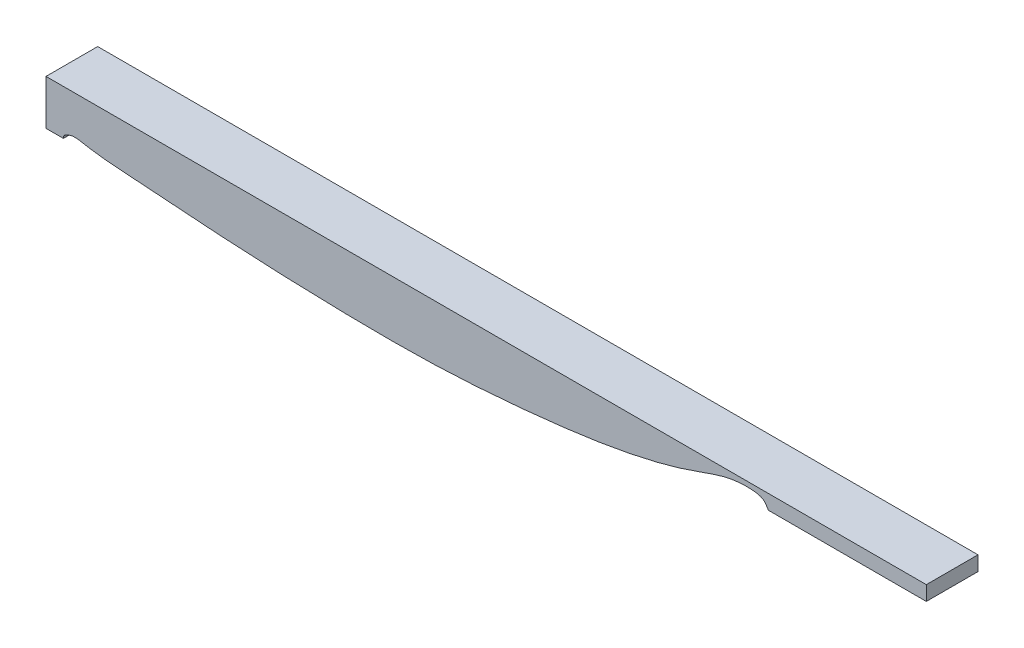
ISO-10303-21;
HEADER;
FILE_DESCRIPTION(('STEP AP214'),'2;1');
FILE_NAME('part.step','',(''),(''),'','','');
FILE_SCHEMA(('AUTOMOTIVE_DESIGN { 1 0 10303 214 1 1 1 1 }'));
ENDSEC;
DATA;
#1=APPLICATION_CONTEXT('core data for automotive mechanical design processes');
#2=APPLICATION_PROTOCOL_DEFINITION('international standard','automotive_design',2000,#1);
#3=PRODUCT_CONTEXT('',#1,'mechanical');
#4=PRODUCT('Part','Part','',(#3));
#5=PRODUCT_RELATED_PRODUCT_CATEGORY('part','',(#4));
#6=PRODUCT_DEFINITION_FORMATION('','',#4);
#7=PRODUCT_DEFINITION_CONTEXT('part definition',#1,'design');
#8=PRODUCT_DEFINITION('design','',#6,#7);
#9=PRODUCT_DEFINITION_SHAPE('','',#8);
#10=(LENGTH_UNIT() NAMED_UNIT(*) SI_UNIT(.MILLI.,.METRE.));
#11=(NAMED_UNIT(*) PLANE_ANGLE_UNIT() SI_UNIT($,.RADIAN.));
#12=(NAMED_UNIT(*) SI_UNIT($,.STERADIAN.) SOLID_ANGLE_UNIT());
#13=UNCERTAINTY_MEASURE_WITH_UNIT(LENGTH_MEASURE(1.E-05),#10,'distance_accuracy_value','');
#14=(GEOMETRIC_REPRESENTATION_CONTEXT(3) GLOBAL_UNCERTAINTY_ASSIGNED_CONTEXT((#13)) GLOBAL_UNIT_ASSIGNED_CONTEXT((#10,
#11,#12)) REPRESENTATION_CONTEXT('',''));
#15=CARTESIAN_POINT('',(0.,0.,0.));
#16=DIRECTION('',(0.,0.,1.));
#17=DIRECTION('',(1.,0.,0.));
#18=AXIS2_PLACEMENT_3D('',#15,#16,#17);
#19=CARTESIAN_POINT('',(-74.7926333005804,-4.71539229027496,500.));
#20=CARTESIAN_POINT('',(-74.7945725468308,-4.64169918988929,500.));
#21=CARTESIAN_POINT('',(-74.7956405223139,-4.5669255233357,500.));
#22=CARTESIAN_POINT('',(-74.7682275652313,-4.4215014351939,500.));
#23=CARTESIAN_POINT('',(-74.7393396719435,-4.35122443452808,500.));
#24=CARTESIAN_POINT('',(-74.6541649574875,-4.23140071534592,500.));
#25=CARTESIAN_POINT('',(-74.5952717248445,-4.18346464085846,500.));
#26=CARTESIAN_POINT('',(-74.472232026393,-4.10658868034385,500.));
#27=CARTESIAN_POINT('',(-74.4083565466093,-4.07230546591333,500.));
#28=CARTESIAN_POINT('',(-74.0910930728462,-3.8971609381395,500.));
#29=CARTESIAN_POINT('',(-73.8228264342802,-3.77733079104681,500.));
#30=CARTESIAN_POINT('',(-73.3969897090454,-3.69655194401499,500.));
#31=CARTESIAN_POINT('',(-73.2507537679305,-3.68371619555192,500.));
#32=CARTESIAN_POINT('',(-72.9622916337156,-3.67746946263042,500.));
#33=CARTESIAN_POINT('',(-72.8186453982501,-3.6836659885184,500.));
#34=CARTESIAN_POINT('',(-72.38872759527,-3.71852470973582,500.));
#35=CARTESIAN_POINT('',(-72.1031532164035,-3.76168161506621,500.));
#36=CARTESIAN_POINT('',(-71.5338997361211,-3.86135873448905,500.));
#37=CARTESIAN_POINT('',(-71.2503899064792,-3.91857891513571,500.));
#38=CARTESIAN_POINT('',(-70.6814803741391,-4.02052917402074,500.));
#39=CARTESIAN_POINT('',(-70.3963885082395,-4.06729373448404,500.));
#40=CARTESIAN_POINT('',(-69.5389001396878,-4.19296329365171,500.));
#41=CARTESIAN_POINT('',(-68.9639748335471,-4.25649582072183,500.));
#42=CARTESIAN_POINT('',(-67.8122730176995,-4.36494349914614,500.));
#43=CARTESIAN_POINT('',(-67.2356798980453,-4.40951686606346,500.));
#44=CARTESIAN_POINT('',(-66.0824703463037,-4.49836048424999,500.));
#45=CARTESIAN_POINT('',(-65.5059095068004,-4.54335356792675,500.));
#46=CARTESIAN_POINT('',(-63.7759582658489,-4.67483880455262,500.));
#47=CARTESIAN_POINT('',(-62.6223117172394,-4.75800045087998,500.));
#48=CARTESIAN_POINT('',(-59.1613455171114,-5.00714012243561,500.));
#49=CARTESIAN_POINT('',(-56.8537968480041,-5.1701246724821,500.));
#50=CARTESIAN_POINT('',(-52.2377474418746,-5.48208649526239,500.));
#51=CARTESIAN_POINT('',(-49.9290338140273,-5.62838689929557,500.));
#52=CARTESIAN_POINT('',(-45.3097349084676,-5.88528373667809,500.));
#53=CARTESIAN_POINT('',(-42.9989883793476,-5.99606203608369,500.));
#54=CARTESIAN_POINT('',(-38.3762612017863,-6.17825690245451,500.));
#55=CARTESIAN_POINT('',(-36.0644189723049,-6.25055351148465,500.));
#56=CARTESIAN_POINT('',(-31.4399540416971,-6.36449010102732,500.));
#57=CARTESIAN_POINT('',(-29.1273420464109,-6.40655060285978,500.));
#58=CARTESIAN_POINT('',(-24.5009026983581,-6.44293282827627,500.));
#59=CARTESIAN_POINT('',(-22.1876388977882,-6.43588554790579,500.));
#60=CARTESIAN_POINT('',(-17.5622645478349,-6.34057695604946,500.));
#61=CARTESIAN_POINT('',(-15.2504436589645,-6.25148343036184,500.));
#62=CARTESIAN_POINT('',(-10.6338606527194,-5.99181558491172,500.));
#63=CARTESIAN_POINT('',(-8.32821716846093,-5.82325504427962,500.));
#64=CARTESIAN_POINT('',(-3.72092935671084,-5.42764728901088,500.));
#65=CARTESIAN_POINT('',(-1.41871000812324,-5.20011518013204,500.));
#66=CARTESIAN_POINT('',(3.17658171697913,-4.672543946867,500.));
#67=CARTESIAN_POINT('',(5.47096725490909,-4.37454900242464,500.));
#68=CARTESIAN_POINT('',(8.8991543822941,-3.8451804505402,500.));
#69=CARTESIAN_POINT('',(10.0393568862103,-3.65439157818723,500.));
#70=CARTESIAN_POINT('',(12.313175735897,-3.23545150921731,500.));
#71=CARTESIAN_POINT('',(13.4470128405496,-3.00668345580054,500.));
#72=CARTESIAN_POINT('',(15.7065243350755,-2.51115196509788,500.));
#73=CARTESIAN_POINT('',(16.8314927717673,-2.24543901580171,500.));
#74=CARTESIAN_POINT('',(19.0681514075692,-1.66423417883567,500.));
#75=CARTESIAN_POINT('',(20.1797168960365,-1.34827476199462,500.));
#76=CARTESIAN_POINT('',(21.8322121034182,-0.818652958403885,500.));
#77=CARTESIAN_POINT('',(22.3806133737634,-0.632964751650442,500.));
#78=CARTESIAN_POINT('',(23.4745977305323,-0.251714185271417,500.));
#79=CARTESIAN_POINT('',(24.0198153161863,-0.0547273099881246,500.));
#80=CARTESIAN_POINT('',(25.6575931319565,0.52861536663819,500.));
#81=CARTESIAN_POINT('',(26.7531107345004,0.904369525850969,500.));
#82=CARTESIAN_POINT('',(28.4483206177596,1.28182868892305,500.));
#83=CARTESIAN_POINT('',(29.0224629114196,1.37512574816498,500.));
#84=CARTESIAN_POINT('',(30.1897519726394,1.49359228512873,500.));
#85=CARTESIAN_POINT('',(30.7798455836017,1.51990450574938,500.));
#86=CARTESIAN_POINT('',(31.6578059291401,1.49536836942824,500.));
#87=CARTESIAN_POINT('',(31.9500625145701,1.47700096365145,500.));
#88=CARTESIAN_POINT('',(32.3871741682909,1.41676227533782,500.));
#89=CARTESIAN_POINT('',(32.5328176215044,1.39133693180517,500.));
#90=CARTESIAN_POINT('',(32.8229989541255,1.32775463723204,500.));
#91=CARTESIAN_POINT('',(32.9658317262134,1.28942763038719,500.));
#92=CARTESIAN_POINT('',(33.2434271180678,1.18941318569901,500.));
#93=CARTESIAN_POINT('',(33.3802106279673,1.12603395811575,500.));
#94=CARTESIAN_POINT('',(33.6269293118561,0.962446148861271,500.));
#95=CARTESIAN_POINT('',(33.7339165324965,0.860387328718621,500.));
#96=CARTESIAN_POINT('',(33.9276639242706,0.633447513574679,500.));
#97=CARTESIAN_POINT('',(34.0117892478651,0.51070487600079,500.));
#98=CARTESIAN_POINT('',(34.1435301858947,0.330629947473623,500.));
#99=CARTESIAN_POINT('',(34.1877309860986,0.270813837437645,500.));
#100=CARTESIAN_POINT('',(34.2652055782027,0.143233685237576,500.));
#101=CARTESIAN_POINT('',(34.2961884644061,0.0749305651906201,500.));
#102=CARTESIAN_POINT('',(34.3054676045378,0.,500.));
#103=B_SPLINE_CURVE_WITH_KNOTS('',3,(#19,#20,#21,#22,#23,#24,#25,#26,#27,#28,#29,#30,#31,#32,
#33,#34,#35,#36,#37,#38,#39,#40,#41,#42,#43,#44,#45,#46,#47,#48,#49,#50,#51,#52,#53,#54,#55,#56,
#57,#58,#59,#60,#61,#62,#63,#64,#65,#66,#67,#68,#69,#70,#71,#72,#73,#74,#75,#76,#77,#78,#79,#80,
#81,#82,#83,#84,#85,#86,#87,#88,#89,#90,#91,#92,#93,#94,#95,#96,#97,#98,#99,#100,#101,#102),
.UNSPECIFIED.,.F.,.F.,(4,2,2,2,2,2,2,2,2,2,2,2,2,2,2,2,2,2,2,2,2,2,2,2,2,2,2,2,2,2,2,2,2,2,2,2,
2,2,2,2,2,4),(0.,0.001953125,0.00390625000000011,0.00585937500000022,0.00781250000000033,
0.015625,0.0195312499999999,0.0234374999999999,0.0312499999999999,0.0390624999999999,
0.0468749999999999,0.0624999999999999,0.078125,0.09375,0.125,0.1875,0.25,0.3125,0.375,0.4375,
0.5,0.5625,0.625,0.6875,0.75,0.78125,0.8125,0.84375,0.875,0.890625,0.90625,0.9375,0.953125,
0.96875,0.9765625,0.98046875,0.984375,0.98828125,0.9921875,0.99609375,0.998046875,1.),.UNSPECIFIED.);
#104=DIRECTION('',(0.,0.,-1.));
#105=VECTOR('',#104,1.);
#106=SURFACE_OF_LINEAR_EXTRUSION('',#103,#105);
#107=CARTESIAN_POINT('',(-74.7926333005804,-4.71539229027496,492.));
#108=CARTESIAN_POINT('',(-74.7945725468308,-4.64169918988929,492.));
#109=CARTESIAN_POINT('',(-74.7956405223139,-4.5669255233357,492.));
#110=CARTESIAN_POINT('',(-74.7682275652313,-4.4215014351939,492.));
#111=CARTESIAN_POINT('',(-74.7393396719435,-4.35122443452808,492.));
#112=CARTESIAN_POINT('',(-74.6541649574875,-4.23140071534592,492.));
#113=CARTESIAN_POINT('',(-74.5952717248445,-4.18346464085846,492.));
#114=CARTESIAN_POINT('',(-74.472232026393,-4.10658868034385,492.));
#115=CARTESIAN_POINT('',(-74.4083565466093,-4.07230546591333,492.));
#116=CARTESIAN_POINT('',(-74.0910930728462,-3.8971609381395,492.));
#117=CARTESIAN_POINT('',(-73.8228264342802,-3.77733079104681,492.));
#118=CARTESIAN_POINT('',(-73.3969897090454,-3.69655194401499,492.));
#119=CARTESIAN_POINT('',(-73.2507537679305,-3.68371619555192,492.));
#120=CARTESIAN_POINT('',(-72.9622916337156,-3.67746946263042,492.));
#121=CARTESIAN_POINT('',(-72.8186453982501,-3.6836659885184,492.));
#122=CARTESIAN_POINT('',(-72.38872759527,-3.71852470973582,492.));
#123=CARTESIAN_POINT('',(-72.1031532164035,-3.76168161506621,492.));
#124=CARTESIAN_POINT('',(-71.5338997361211,-3.86135873448905,492.));
#125=CARTESIAN_POINT('',(-71.2503899064792,-3.91857891513571,492.));
#126=CARTESIAN_POINT('',(-70.6814803741391,-4.02052917402074,492.));
#127=CARTESIAN_POINT('',(-70.3963885082395,-4.06729373448404,492.));
#128=CARTESIAN_POINT('',(-69.5389001396878,-4.19296329365171,492.));
#129=CARTESIAN_POINT('',(-68.9639748335471,-4.25649582072183,492.));
#130=CARTESIAN_POINT('',(-67.8122730176995,-4.36494349914614,492.));
#131=CARTESIAN_POINT('',(-67.2356798980453,-4.40951686606346,492.));
#132=CARTESIAN_POINT('',(-66.0824703463037,-4.49836048424999,492.));
#133=CARTESIAN_POINT('',(-65.5059095068004,-4.54335356792675,492.));
#134=CARTESIAN_POINT('',(-63.7759582658489,-4.67483880455262,492.));
#135=CARTESIAN_POINT('',(-62.6223117172394,-4.75800045087998,492.));
#136=CARTESIAN_POINT('',(-59.1613455171114,-5.00714012243561,492.));
#137=CARTESIAN_POINT('',(-56.8537968480041,-5.1701246724821,492.));
#138=CARTESIAN_POINT('',(-52.2377474418746,-5.48208649526239,492.));
#139=CARTESIAN_POINT('',(-49.9290338140273,-5.62838689929557,492.));
#140=CARTESIAN_POINT('',(-45.3097349084676,-5.88528373667809,492.));
#141=CARTESIAN_POINT('',(-42.9989883793476,-5.99606203608369,492.));
#142=CARTESIAN_POINT('',(-38.3762612017863,-6.17825690245451,492.));
#143=CARTESIAN_POINT('',(-36.0644189723049,-6.25055351148465,492.));
#144=CARTESIAN_POINT('',(-31.4399540416971,-6.36449010102732,492.));
#145=CARTESIAN_POINT('',(-29.1273420464109,-6.40655060285978,492.));
#146=CARTESIAN_POINT('',(-24.5009026983581,-6.44293282827627,492.));
#147=CARTESIAN_POINT('',(-22.1876388977882,-6.43588554790579,492.));
#148=CARTESIAN_POINT('',(-17.5622645478349,-6.34057695604946,492.));
#149=CARTESIAN_POINT('',(-15.2504436589645,-6.25148343036184,492.));
#150=CARTESIAN_POINT('',(-10.6338606527194,-5.99181558491172,492.));
#151=CARTESIAN_POINT('',(-8.32821716846093,-5.82325504427962,492.));
#152=CARTESIAN_POINT('',(-3.72092935671084,-5.42764728901088,492.));
#153=CARTESIAN_POINT('',(-1.41871000812324,-5.20011518013204,492.));
#154=CARTESIAN_POINT('',(3.17658171697913,-4.672543946867,492.));
#155=CARTESIAN_POINT('',(5.47096725490909,-4.37454900242464,492.));
#156=CARTESIAN_POINT('',(8.8991543822941,-3.8451804505402,492.));
#157=CARTESIAN_POINT('',(10.0393568862103,-3.65439157818723,492.));
#158=CARTESIAN_POINT('',(12.313175735897,-3.23545150921731,492.));
#159=CARTESIAN_POINT('',(13.4470128405496,-3.00668345580054,492.));
#160=CARTESIAN_POINT('',(15.7065243350755,-2.51115196509788,492.));
#161=CARTESIAN_POINT('',(16.8314927717673,-2.24543901580171,492.));
#162=CARTESIAN_POINT('',(19.0681514075692,-1.66423417883567,492.));
#163=CARTESIAN_POINT('',(20.1797168960365,-1.34827476199462,492.));
#164=CARTESIAN_POINT('',(21.8322121034182,-0.818652958403885,492.));
#165=CARTESIAN_POINT('',(22.3806133737634,-0.632964751650442,492.));
#166=CARTESIAN_POINT('',(23.4745977305323,-0.251714185271417,492.));
#167=CARTESIAN_POINT('',(24.0198153161863,-0.0547273099881246,492.));
#168=CARTESIAN_POINT('',(25.6575931319565,0.52861536663819,492.));
#169=CARTESIAN_POINT('',(26.7531107345004,0.904369525850969,492.));
#170=CARTESIAN_POINT('',(28.4483206177596,1.28182868892305,492.));
#171=CARTESIAN_POINT('',(29.0224629114196,1.37512574816498,492.));
#172=CARTESIAN_POINT('',(30.1897519726394,1.49359228512873,492.));
#173=CARTESIAN_POINT('',(30.7798455836017,1.51990450574938,492.));
#174=CARTESIAN_POINT('',(31.6578059291401,1.49536836942824,492.));
#175=CARTESIAN_POINT('',(31.9500625145701,1.47700096365145,492.));
#176=CARTESIAN_POINT('',(32.3871741682909,1.41676227533782,492.));
#177=CARTESIAN_POINT('',(32.5328176215044,1.39133693180517,492.));
#178=CARTESIAN_POINT('',(32.8229989541255,1.32775463723204,492.));
#179=CARTESIAN_POINT('',(32.9658317262134,1.28942763038719,492.));
#180=CARTESIAN_POINT('',(33.2434271180678,1.18941318569901,492.));
#181=CARTESIAN_POINT('',(33.3802106279673,1.12603395811575,492.));
#182=CARTESIAN_POINT('',(33.6269293118561,0.962446148861271,492.));
#183=CARTESIAN_POINT('',(33.7339165324965,0.860387328718621,492.));
#184=CARTESIAN_POINT('',(33.9276639242706,0.633447513574679,492.));
#185=CARTESIAN_POINT('',(34.0117892478651,0.51070487600079,492.));
#186=CARTESIAN_POINT('',(34.1435301858947,0.330629947473623,492.));
#187=CARTESIAN_POINT('',(34.1877309860986,0.270813837437645,492.));
#188=CARTESIAN_POINT('',(34.2652055782027,0.143233685237576,492.));
#189=CARTESIAN_POINT('',(34.2961884644061,0.0749305651906201,492.));
#190=CARTESIAN_POINT('',(34.3054676045378,0.,492.));
#191=B_SPLINE_CURVE_WITH_KNOTS('',3,(#107,#108,#109,#110,#111,#112,#113,#114,#115,#116,#117,
#118,#119,#120,#121,#122,#123,#124,#125,#126,#127,#128,#129,#130,#131,#132,#133,#134,#135,#136,
#137,#138,#139,#140,#141,#142,#143,#144,#145,#146,#147,#148,#149,#150,#151,#152,#153,#154,#155,
#156,#157,#158,#159,#160,#161,#162,#163,#164,#165,#166,#167,#168,#169,#170,#171,#172,#173,#174,
#175,#176,#177,#178,#179,#180,#181,#182,#183,#184,#185,#186,#187,#188,#189,#190),.UNSPECIFIED.,
.F.,.F.,(4,2,2,2,2,2,2,2,2,2,2,2,2,2,2,2,2,2,2,2,2,2,2,2,2,2,2,2,2,2,2,2,2,2,2,2,2,2,2,2,2,4),
(0.,0.001953125,0.00390625000000011,0.00585937500000022,0.00781250000000033,0.015625,
0.0195312499999999,0.0234374999999999,0.0312499999999999,0.0390624999999999,0.0468749999999999,
0.0624999999999999,0.078125,0.09375,0.125,0.1875,0.25,0.3125,0.375,0.4375,0.5,0.5625,0.625,
0.6875,0.75,0.78125,0.8125,0.84375,0.875,0.890625,0.90625,0.9375,0.953125,0.96875,0.9765625,
0.98046875,0.984375,0.98828125,0.9921875,0.99609375,0.998046875,1.),.UNSPECIFIED.);
#192=CARTESIAN_POINT('',(-74.7926333005804,-4.715392290275,492.));
#193=VERTEX_POINT('',#192);
#194=CARTESIAN_POINT('',(34.3054676045377,0.,492.));
#195=VERTEX_POINT('',#194);
#196=EDGE_CURVE('E165',#193,#195,#191,.T.);
#197=ORIENTED_EDGE('',*,*,#196,.T.);
#198=DIRECTION('',(0.,0.,-1.));
#199=VECTOR('',#198,1.);
#200=CARTESIAN_POINT('',(34.3054676045377,0.,500.));
#201=LINE('',#200,#199);
#202=CARTESIAN_POINT('',(34.3054676045377,0.,500.));
#203=VERTEX_POINT('',#202);
#204=EDGE_CURVE('E11',#203,#195,#201,.T.);
#205=ORIENTED_EDGE('',*,*,#204,.F.);
#206=CARTESIAN_POINT('',(34.3054676045378,0.,500.));
#207=CARTESIAN_POINT('',(34.2961884644061,0.0749305651906201,500.));
#208=CARTESIAN_POINT('',(34.2652055782027,0.143233685237576,500.));
#209=CARTESIAN_POINT('',(34.1877309860986,0.270813837437645,500.));
#210=CARTESIAN_POINT('',(34.1435301858947,0.330629947473623,500.));
#211=CARTESIAN_POINT('',(34.0117892478651,0.51070487600079,500.));
#212=CARTESIAN_POINT('',(33.9276639242706,0.633447513574679,500.));
#213=CARTESIAN_POINT('',(33.7339165324965,0.860387328718621,500.));
#214=CARTESIAN_POINT('',(33.6269293118561,0.962446148861271,500.));
#215=CARTESIAN_POINT('',(33.3802106279673,1.12603395811575,500.));
#216=CARTESIAN_POINT('',(33.2434271180678,1.18941318569901,500.));
#217=CARTESIAN_POINT('',(32.9658317262134,1.28942763038719,500.));
#218=CARTESIAN_POINT('',(32.8229989541255,1.32775463723204,500.));
#219=CARTESIAN_POINT('',(32.5328176215044,1.39133693180517,500.));
#220=CARTESIAN_POINT('',(32.3871741682909,1.41676227533782,500.));
#221=CARTESIAN_POINT('',(31.9500625145701,1.47700096365145,500.));
#222=CARTESIAN_POINT('',(31.6578059291401,1.49536836942824,500.));
#223=CARTESIAN_POINT('',(30.7798455836017,1.51990450574938,500.));
#224=CARTESIAN_POINT('',(30.1897519726394,1.49359228512873,500.));
#225=CARTESIAN_POINT('',(29.0224629114196,1.37512574816498,500.));
#226=CARTESIAN_POINT('',(28.4483206177596,1.28182868892305,500.));
#227=CARTESIAN_POINT('',(26.7531107345004,0.904369525850969,500.));
#228=CARTESIAN_POINT('',(25.6575931319565,0.52861536663819,500.));
#229=CARTESIAN_POINT('',(24.0198153161863,-0.0547273099881246,500.));
#230=CARTESIAN_POINT('',(23.4745977305323,-0.251714185271417,500.));
#231=CARTESIAN_POINT('',(22.3806133737634,-0.632964751650442,500.));
#232=CARTESIAN_POINT('',(21.8322121034182,-0.818652958403885,500.));
#233=CARTESIAN_POINT('',(20.1797168960365,-1.34827476199462,500.));
#234=CARTESIAN_POINT('',(19.0681514075692,-1.66423417883567,500.));
#235=CARTESIAN_POINT('',(16.8314927717673,-2.24543901580171,500.));
#236=CARTESIAN_POINT('',(15.7065243350755,-2.51115196509788,500.));
#237=CARTESIAN_POINT('',(13.4470128405496,-3.00668345580054,500.));
#238=CARTESIAN_POINT('',(12.313175735897,-3.23545150921731,500.));
#239=CARTESIAN_POINT('',(10.0393568862103,-3.65439157818723,500.));
#240=CARTESIAN_POINT('',(8.8991543822941,-3.8451804505402,500.));
#241=CARTESIAN_POINT('',(5.47096725490909,-4.37454900242464,500.));
#242=CARTESIAN_POINT('',(3.17658171697913,-4.672543946867,500.));
#243=CARTESIAN_POINT('',(-1.41871000812324,-5.20011518013204,500.));
#244=CARTESIAN_POINT('',(-3.72092935671084,-5.42764728901088,500.));
#245=CARTESIAN_POINT('',(-8.32821716846093,-5.82325504427962,500.));
#246=CARTESIAN_POINT('',(-10.6338606527194,-5.99181558491172,500.));
#247=CARTESIAN_POINT('',(-15.2504436589645,-6.25148343036184,500.));
#248=CARTESIAN_POINT('',(-17.5622645478349,-6.34057695604946,500.));
#249=CARTESIAN_POINT('',(-22.1876388977882,-6.43588554790579,500.));
#250=CARTESIAN_POINT('',(-24.5009026983581,-6.44293282827627,500.));
#251=CARTESIAN_POINT('',(-29.1273420464109,-6.40655060285978,500.));
#252=CARTESIAN_POINT('',(-31.4399540416971,-6.36449010102732,500.));
#253=CARTESIAN_POINT('',(-36.0644189723049,-6.25055351148465,500.));
#254=CARTESIAN_POINT('',(-38.3762612017863,-6.17825690245451,500.));
#255=CARTESIAN_POINT('',(-42.9989883793476,-5.99606203608369,500.));
#256=CARTESIAN_POINT('',(-45.3097349084676,-5.88528373667809,500.));
#257=CARTESIAN_POINT('',(-49.9290338140273,-5.62838689929557,500.));
#258=CARTESIAN_POINT('',(-52.2377474418746,-5.48208649526239,500.));
#259=CARTESIAN_POINT('',(-56.8537968480041,-5.1701246724821,500.));
#260=CARTESIAN_POINT('',(-59.1613455171114,-5.00714012243561,500.));
#261=CARTESIAN_POINT('',(-62.6223117172394,-4.75800045087998,500.));
#262=CARTESIAN_POINT('',(-63.7759582658489,-4.67483880455262,500.));
#263=CARTESIAN_POINT('',(-65.5059095068004,-4.54335356792675,500.));
#264=CARTESIAN_POINT('',(-66.0824703463037,-4.49836048424999,500.));
#265=CARTESIAN_POINT('',(-67.2356798980453,-4.40951686606346,500.));
#266=CARTESIAN_POINT('',(-67.8122730176995,-4.36494349914614,500.));
#267=CARTESIAN_POINT('',(-68.9639748335471,-4.25649582072183,500.));
#268=CARTESIAN_POINT('',(-69.5389001396878,-4.19296329365171,500.));
#269=CARTESIAN_POINT('',(-70.3963885082395,-4.06729373448404,500.));
#270=CARTESIAN_POINT('',(-70.6814803741391,-4.02052917402074,500.));
#271=CARTESIAN_POINT('',(-71.2503899064792,-3.91857891513571,500.));
#272=CARTESIAN_POINT('',(-71.5338997361211,-3.86135873448905,500.));
#273=CARTESIAN_POINT('',(-72.1031532164035,-3.76168161506621,500.));
#274=CARTESIAN_POINT('',(-72.38872759527,-3.71852470973582,500.));
#275=CARTESIAN_POINT('',(-72.8186453982501,-3.6836659885184,500.));
#276=CARTESIAN_POINT('',(-72.9622916337156,-3.67746946263042,500.));
#277=CARTESIAN_POINT('',(-73.2507537679305,-3.68371619555192,500.));
#278=CARTESIAN_POINT('',(-73.3969897090454,-3.69655194401499,500.));
#279=CARTESIAN_POINT('',(-73.8228264342802,-3.77733079104681,500.));
#280=CARTESIAN_POINT('',(-74.0910930728462,-3.8971609381395,500.));
#281=CARTESIAN_POINT('',(-74.4083565466093,-4.07230546591333,500.));
#282=CARTESIAN_POINT('',(-74.472232026393,-4.10658868034385,500.));
#283=CARTESIAN_POINT('',(-74.5952717248445,-4.18346464085846,500.));
#284=CARTESIAN_POINT('',(-74.6541649574875,-4.23140071534592,500.));
#285=CARTESIAN_POINT('',(-74.7393396719435,-4.35122443452808,500.));
#286=CARTESIAN_POINT('',(-74.7682275652313,-4.4215014351939,500.));
#287=CARTESIAN_POINT('',(-74.7956405223139,-4.5669255233357,500.));
#288=CARTESIAN_POINT('',(-74.7945725468308,-4.64169918988929,500.));
#289=CARTESIAN_POINT('',(-74.7926333005804,-4.71539229027496,500.));
#290=B_SPLINE_CURVE_WITH_KNOTS('',3,(#206,#207,#208,#209,#210,#211,#212,#213,#214,#215,#216,
#217,#218,#219,#220,#221,#222,#223,#224,#225,#226,#227,#228,#229,#230,#231,#232,#233,#234,#235,
#236,#237,#238,#239,#240,#241,#242,#243,#244,#245,#246,#247,#248,#249,#250,#251,#252,#253,#254,
#255,#256,#257,#258,#259,#260,#261,#262,#263,#264,#265,#266,#267,#268,#269,#270,#271,#272,#273,
#274,#275,#276,#277,#278,#279,#280,#281,#282,#283,#284,#285,#286,#287,#288,#289),.UNSPECIFIED.,
.F.,.F.,(4,2,2,2,2,2,2,2,2,2,2,2,2,2,2,2,2,2,2,2,2,2,2,2,2,2,2,2,2,2,2,2,2,2,2,2,2,2,2,2,2,4),
(0.,0.001953125,0.00390625,0.0078125,0.01171875,0.015625,0.0195312499999999,0.0234374999999999,
0.0312499999999999,0.0468749999999999,0.0624999999999998,0.0937499999999998,0.109375,0.125,
0.15625,0.1875,0.21875,0.25,0.3125,0.375,0.4375,0.5,0.5625,0.625,0.6875,0.75,0.8125,0.875,
0.90625,0.921875,0.9375,0.953125,0.9609375,0.96875,0.9765625,0.98046875,0.984375,0.9921875,
0.994140625,0.99609375,0.998046875,1.),.UNSPECIFIED.);
#291=CARTESIAN_POINT('',(-74.7926333005804,-4.715392290275,500.));
#292=VERTEX_POINT('',#291);
#293=EDGE_CURVE('E129',#292,#203,#290,.F.);
#294=ORIENTED_EDGE('',*,*,#293,.F.);
#295=DIRECTION('',(0.,0.,-1.));
#296=VECTOR('',#295,1.);
#297=CARTESIAN_POINT('',(-74.7926333005804,-4.715392290275,500.));
#298=LINE('',#297,#296);
#299=EDGE_CURVE('E114',#292,#193,#298,.T.);
#300=ORIENTED_EDGE('',*,*,#299,.T.);
#301=EDGE_LOOP('',(#197,#205,#294,#300));
#302=FACE_BOUND('',#301,.T.);
#303=ADVANCED_FACE('F30',(#302),#106,.F.);
#304=CARTESIAN_POINT('',(34.3054676045377,0.,500.));
#305=DIRECTION('',(0.,1.,0.));
#306=DIRECTION('',(-1.,0.,0.));
#307=AXIS2_PLACEMENT_3D('',#304,#305,#306);
#308=PLANE('',#307);
#309=DIRECTION('',(1.,0.,0.));
#310=VECTOR('',#309,1.);
#311=CARTESIAN_POINT('',(34.3054676045377,0.,492.));
#312=LINE('',#311,#310);
#313=CARTESIAN_POINT('',(58.7706582821447,0.,492.));
#314=VERTEX_POINT('',#313);
#315=EDGE_CURVE('E120',#195,#314,#312,.T.);
#316=ORIENTED_EDGE('',*,*,#315,.T.);
#317=DIRECTION('',(0.,0.,-1.));
#318=VECTOR('',#317,1.);
#319=CARTESIAN_POINT('',(58.7706582821447,0.,500.));
#320=LINE('',#319,#318);
#321=CARTESIAN_POINT('',(58.7706582821447,0.,500.));
#322=VERTEX_POINT('',#321);
#323=EDGE_CURVE('E41',#322,#314,#320,.T.);
#324=ORIENTED_EDGE('',*,*,#323,.F.);
#325=DIRECTION('',(1.,0.,0.));
#326=VECTOR('',#325,1.);
#327=CARTESIAN_POINT('',(34.3054676045377,0.,500.));
#328=LINE('',#327,#326);
#329=EDGE_CURVE('E87',#203,#322,#328,.T.);
#330=ORIENTED_EDGE('',*,*,#329,.F.);
#331=ORIENTED_EDGE('',*,*,#204,.T.);
#332=EDGE_LOOP('',(#316,#324,#330,#331));
#333=FACE_BOUND('',#332,.T.);
#334=ADVANCED_FACE('F199',(#333),#308,.F.);
#335=CARTESIAN_POINT('',(58.7706582821447,2.25600000000005,500.));
#336=DIRECTION('',(-1.,0.,0.));
#337=DIRECTION('',(0.,-1.,0.));
#338=AXIS2_PLACEMENT_3D('',#335,#336,#337);
#339=PLANE('',#338);
#340=DIRECTION('',(0.,1.,0.));
#341=VECTOR('',#340,1.);
#342=CARTESIAN_POINT('',(58.7706582821447,2.25600000000005,492.));
#343=LINE('',#342,#341);
#344=CARTESIAN_POINT('',(58.7706582821447,2.25600000000005,492.));
#345=VERTEX_POINT('',#344);
#346=EDGE_CURVE('E118',#314,#345,#343,.T.);
#347=ORIENTED_EDGE('',*,*,#346,.T.);
#348=DIRECTION('',(0.,0.,-1.));
#349=VECTOR('',#348,1.);
#350=CARTESIAN_POINT('',(58.7706582821447,2.25600000000005,500.));
#351=LINE('',#350,#349);
#352=CARTESIAN_POINT('',(58.7706582821447,2.25600000000005,500.));
#353=VERTEX_POINT('',#352);
#354=EDGE_CURVE('E109',#353,#345,#351,.T.);
#355=ORIENTED_EDGE('',*,*,#354,.F.);
#356=DIRECTION('',(0.,1.,0.));
#357=VECTOR('',#356,1.);
#358=CARTESIAN_POINT('',(58.7706582821447,2.25600000000005,500.));
#359=LINE('',#358,#357);
#360=EDGE_CURVE('E100',#322,#353,#359,.T.);
#361=ORIENTED_EDGE('',*,*,#360,.F.);
#362=ORIENTED_EDGE('',*,*,#323,.T.);
#363=EDGE_LOOP('',(#347,#355,#361,#362));
#364=FACE_BOUND('',#363,.T.);
#365=ADVANCED_FACE('F202',(#364),#339,.F.);
#366=CARTESIAN_POINT('',(58.7706582821447,2.25600000000005,500.));
#367=DIRECTION('',(0.,-1.,0.));
#368=DIRECTION('',(1.,0.,0.));
#369=AXIS2_PLACEMENT_3D('',#366,#367,#368);
#370=PLANE('',#369);
#371=DIRECTION('',(-1.,0.,0.));
#372=VECTOR('',#371,1.);
#373=CARTESIAN_POINT('',(58.7706582821447,2.25600000000005,492.));
#374=LINE('',#373,#372);
#375=CARTESIAN_POINT('',(-77.4862826767716,2.25600000000003,492.));
#376=VERTEX_POINT('',#375);
#377=EDGE_CURVE('E108',#345,#376,#374,.T.);
#378=ORIENTED_EDGE('',*,*,#377,.T.);
#379=DIRECTION('',(0.,0.,-1.));
#380=VECTOR('',#379,1.);
#381=CARTESIAN_POINT('',(-77.4862826767716,2.25600000000003,500.));
#382=LINE('',#381,#380);
#383=CARTESIAN_POINT('',(-77.4862826767716,2.25600000000003,500.));
#384=VERTEX_POINT('',#383);
#385=EDGE_CURVE('E105',#384,#376,#382,.T.);
#386=ORIENTED_EDGE('',*,*,#385,.F.);
#387=DIRECTION('',(-1.,0.,0.));
#388=VECTOR('',#387,1.);
#389=CARTESIAN_POINT('',(58.7706582821447,2.25600000000005,500.));
#390=LINE('',#389,#388);
#391=EDGE_CURVE('E94',#353,#384,#390,.T.);
#392=ORIENTED_EDGE('',*,*,#391,.F.);
#393=ORIENTED_EDGE('',*,*,#354,.T.);
#394=EDGE_LOOP('',(#378,#386,#392,#393));
#395=FACE_BOUND('',#394,.T.);
#396=ADVANCED_FACE('F106',(#395),#370,.F.);
#397=CARTESIAN_POINT('',(-77.4862826767715,-4.71538896005358,500.));
#398=DIRECTION('',(1.,0.,0.));
#399=DIRECTION('',(0.,1.,0.));
#400=AXIS2_PLACEMENT_3D('',#397,#398,#399);
#401=PLANE('',#400);
#402=DIRECTION('',(0.,-1.,0.));
#403=VECTOR('',#402,1.);
#404=CARTESIAN_POINT('',(-77.4862826767715,-4.71538896005358,492.));
#405=LINE('',#404,#403);
#406=CARTESIAN_POINT('',(-77.4862826767715,-4.71538896005358,492.));
#407=VERTEX_POINT('',#406);
#408=EDGE_CURVE('E73',#376,#407,#405,.T.);
#409=ORIENTED_EDGE('',*,*,#408,.T.);
#410=DIRECTION('',(0.,0.,-1.));
#411=VECTOR('',#410,1.);
#412=CARTESIAN_POINT('',(-77.4862826767715,-4.71538896005358,500.));
#413=LINE('',#412,#411);
#414=CARTESIAN_POINT('',(-77.4862826767715,-4.71538896005358,500.));
#415=VERTEX_POINT('',#414);
#416=EDGE_CURVE('E110',#415,#407,#413,.T.);
#417=ORIENTED_EDGE('',*,*,#416,.F.);
#418=DIRECTION('',(0.,-1.,0.));
#419=VECTOR('',#418,1.);
#420=CARTESIAN_POINT('',(-77.4862826767715,-4.71538896005358,500.));
#421=LINE('',#420,#419);
#422=EDGE_CURVE('E98',#384,#415,#421,.T.);
#423=ORIENTED_EDGE('',*,*,#422,.F.);
#424=ORIENTED_EDGE('',*,*,#385,.T.);
#425=EDGE_LOOP('',(#409,#417,#423,#424));
#426=FACE_BOUND('',#425,.T.);
#427=ADVANCED_FACE('F112',(#426),#401,.F.);
#428=CARTESIAN_POINT('',(-77.4862826767715,-4.71538896005358,500.));
#429=DIRECTION('',(1.2363232725965E-06,0.999999999999236,0.));
#430=DIRECTION('',(-0.999999999999236,1.2363232725965E-06,0.));
#431=AXIS2_PLACEMENT_3D('',#428,#429,#430);
#432=PLANE('',#431);
#433=DIRECTION('',(0.999999999999236,-1.2363232725965E-06,0.));
#434=VECTOR('',#433,1.);
#435=CARTESIAN_POINT('',(-77.4862826767715,-4.71538896005358,492.));
#436=LINE('',#435,#434);
#437=EDGE_CURVE('E79',#407,#193,#436,.T.);
#438=ORIENTED_EDGE('',*,*,#437,.T.);
#439=ORIENTED_EDGE('',*,*,#299,.F.);
#440=DIRECTION('',(0.999999999999236,-1.2363232725965E-06,0.));
#441=VECTOR('',#440,1.);
#442=CARTESIAN_POINT('',(-77.4862826767715,-4.71538896005358,500.));
#443=LINE('',#442,#441);
#444=EDGE_CURVE('E50',#415,#292,#443,.T.);
#445=ORIENTED_EDGE('',*,*,#444,.F.);
#446=ORIENTED_EDGE('',*,*,#416,.T.);
#447=EDGE_LOOP('',(#438,#439,#445,#446));
#448=FACE_BOUND('',#447,.T.);
#449=ADVANCED_FACE('F145',(#448),#432,.F.);
#450=CARTESIAN_POINT('',(-19.8749517228116,-6.38823125197762,500.));
#451=DIRECTION('',(0.,0.,-1.));
#452=DIRECTION('',(-1.,0.,0.));
#453=AXIS2_PLACEMENT_3D('',#450,#451,#452);
#454=PLANE('',#453);
#455=ORIENTED_EDGE('',*,*,#293,.T.);
#456=ORIENTED_EDGE('',*,*,#329,.T.);
#457=ORIENTED_EDGE('',*,*,#360,.T.);
#458=ORIENTED_EDGE('',*,*,#391,.T.);
#459=ORIENTED_EDGE('',*,*,#422,.T.);
#460=ORIENTED_EDGE('',*,*,#444,.T.);
#461=EDGE_LOOP('',(#455,#456,#457,#458,#459,#460));
#462=FACE_BOUND('',#461,.T.);
#463=ADVANCED_FACE('F96',(#462),#454,.F.);
#464=CARTESIAN_POINT('',(-19.8749517228116,-6.38823125197762,492.));
#465=DIRECTION('',(0.,0.,-1.));
#466=DIRECTION('',(-1.,0.,0.));
#467=AXIS2_PLACEMENT_3D('',#464,#465,#466);
#468=PLANE('',#467);
#469=ORIENTED_EDGE('',*,*,#196,.F.);
#470=ORIENTED_EDGE('',*,*,#437,.F.);
#471=ORIENTED_EDGE('',*,*,#408,.F.);
#472=ORIENTED_EDGE('',*,*,#377,.F.);
#473=ORIENTED_EDGE('',*,*,#346,.F.);
#474=ORIENTED_EDGE('',*,*,#315,.F.);
#475=EDGE_LOOP('',(#469,#470,#471,#472,#473,#474));
#476=FACE_BOUND('',#475,.T.);
#477=ADVANCED_FACE('F144',(#476),#468,.T.);
#478=CLOSED_SHELL('',(#303,#334,#365,#396,#427,#449,#463,#477));
#479=MANIFOLD_SOLID_BREP('B2',#478);
#480=ADVANCED_BREP_SHAPE_REPRESENTATION('',(#18,#479),#14);
#481=SHAPE_DEFINITION_REPRESENTATION(#9,#480);
ENDSEC;
END-ISO-10303-21;
